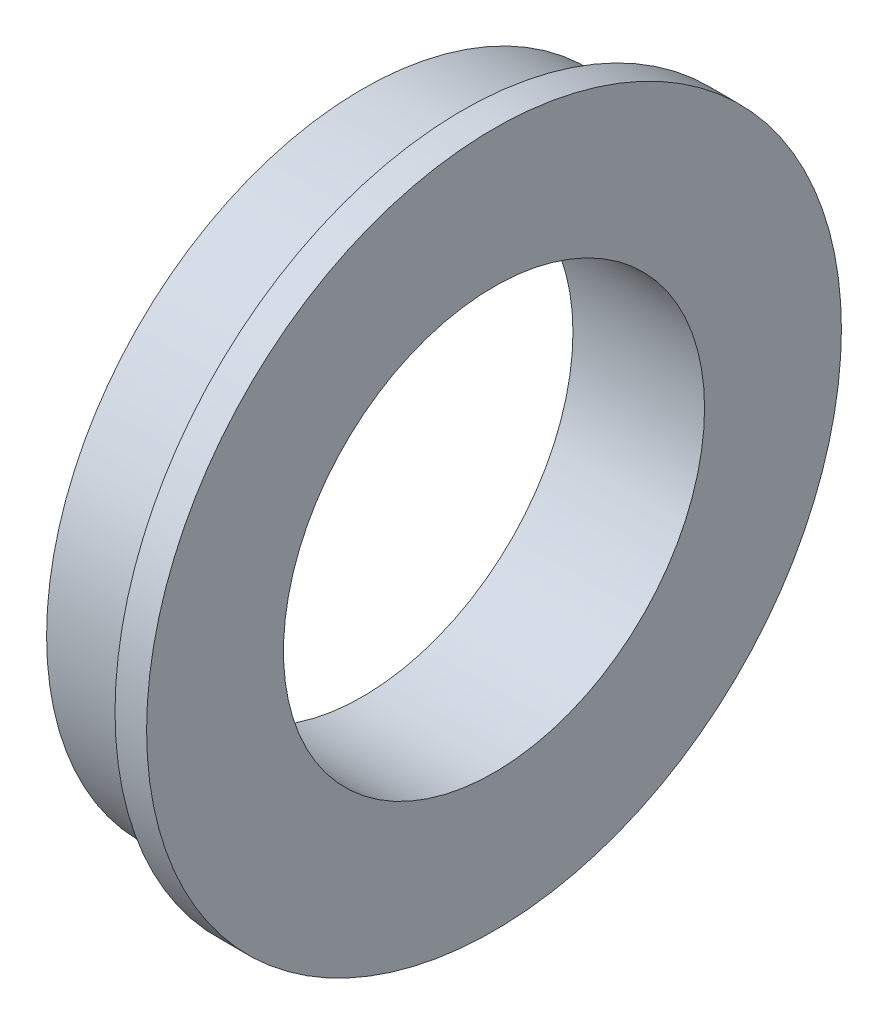
ISO-10303-21;
HEADER;
FILE_DESCRIPTION(('STEP AP214'),'2;1');
FILE_NAME('part.step','',(''),(''),'','','');
FILE_SCHEMA(('AUTOMOTIVE_DESIGN { 1 0 10303 214 1 1 1 1 }'));
ENDSEC;
DATA;
#1=APPLICATION_CONTEXT('core data for automotive mechanical design processes');
#2=APPLICATION_PROTOCOL_DEFINITION('international standard','automotive_design',2000,#1);
#3=PRODUCT_CONTEXT('',#1,'mechanical');
#4=PRODUCT('Part','Part','',(#3));
#5=PRODUCT_RELATED_PRODUCT_CATEGORY('part','',(#4));
#6=PRODUCT_DEFINITION_FORMATION('','',#4);
#7=PRODUCT_DEFINITION_CONTEXT('part definition',#1,'design');
#8=PRODUCT_DEFINITION('design','',#6,#7);
#9=PRODUCT_DEFINITION_SHAPE('','',#8);
#10=(LENGTH_UNIT() NAMED_UNIT(*) SI_UNIT(.MILLI.,.METRE.));
#11=(NAMED_UNIT(*) PLANE_ANGLE_UNIT() SI_UNIT($,.RADIAN.));
#12=(NAMED_UNIT(*) SI_UNIT($,.STERADIAN.) SOLID_ANGLE_UNIT());
#13=UNCERTAINTY_MEASURE_WITH_UNIT(LENGTH_MEASURE(1.E-05),#10,'distance_accuracy_value','');
#14=(GEOMETRIC_REPRESENTATION_CONTEXT(3) GLOBAL_UNCERTAINTY_ASSIGNED_CONTEXT((#13)) GLOBAL_UNIT_ASSIGNED_CONTEXT((#10,
#11,#12)) REPRESENTATION_CONTEXT('',''));
#15=CARTESIAN_POINT('',(0.,0.,0.));
#16=DIRECTION('',(0.,0.,1.));
#17=DIRECTION('',(1.,0.,0.));
#18=AXIS2_PLACEMENT_3D('',#15,#16,#17);
#19=CARTESIAN_POINT('',(0.,0.,0.));
#20=DIRECTION('',(1.,0.,0.));
#21=DIRECTION('',(0.,0.,-1.));
#22=AXIS2_PLACEMENT_3D('',#19,#20,#21);
#23=PLANE('',#22);
#24=CARTESIAN_POINT('',(0.,0.,0.));
#25=DIRECTION('',(1.,0.,0.));
#26=DIRECTION('',(0.,0.,-1.));
#27=AXIS2_PLACEMENT_3D('',#24,#25,#26);
#28=CIRCLE('',#27,4.);
#29=CARTESIAN_POINT('',(0.,0.,-4.));
#30=VERTEX_POINT('',#29);
#31=EDGE_CURVE('E49',#30,#30,#28,.T.);
#32=ORIENTED_EDGE('',*,*,#31,.T.);
#33=EDGE_LOOP('',(#32));
#34=FACE_BOUND('',#33,.T.);
#35=CARTESIAN_POINT('',(0.,0.,0.));
#36=DIRECTION('',(-1.,0.,0.));
#37=DIRECTION('',(0.,0.,1.));
#38=AXIS2_PLACEMENT_3D('',#35,#36,#37);
#39=CIRCLE('',#38,6.);
#40=CARTESIAN_POINT('',(0.,0.,6.));
#41=VERTEX_POINT('',#40);
#42=EDGE_CURVE('E54',#41,#41,#39,.T.);
#43=ORIENTED_EDGE('',*,*,#42,.T.);
#44=EDGE_LOOP('',(#43));
#45=FACE_BOUND('',#44,.T.);
#46=ADVANCED_FACE('F37',(#34,#45),#23,.F.);
#47=CARTESIAN_POINT('',(2.5,0.,0.));
#48=DIRECTION('',(-1.,0.,0.));
#49=DIRECTION('',(0.,0.,1.));
#50=AXIS2_PLACEMENT_3D('',#47,#48,#49);
#51=CYLINDRICAL_SURFACE('',#50,6.6);
#52=CARTESIAN_POINT('',(2.5,0.,0.));
#53=DIRECTION('',(1.,0.,0.));
#54=DIRECTION('',(0.,0.,-1.));
#55=AXIS2_PLACEMENT_3D('',#52,#53,#54);
#56=CIRCLE('',#55,6.6);
#57=CARTESIAN_POINT('',(2.5,0.,-6.6));
#58=VERTEX_POINT('',#57);
#59=EDGE_CURVE('E10',#58,#58,#56,.T.);
#60=ORIENTED_EDGE('',*,*,#59,.F.);
#61=EDGE_LOOP('',(#60));
#62=FACE_BOUND('',#61,.T.);
#63=CARTESIAN_POINT('',(1.9,0.,0.));
#64=DIRECTION('',(-1.,0.,0.));
#65=DIRECTION('',(0.,0.,1.));
#66=AXIS2_PLACEMENT_3D('',#63,#64,#65);
#67=CIRCLE('',#66,6.6);
#68=CARTESIAN_POINT('',(1.9,0.,6.6));
#69=VERTEX_POINT('',#68);
#70=EDGE_CURVE('E41',#69,#69,#67,.T.);
#71=ORIENTED_EDGE('',*,*,#70,.F.);
#72=EDGE_LOOP('',(#71));
#73=FACE_BOUND('',#72,.T.);
#74=ADVANCED_FACE('F39',(#62,#73),#51,.T.);
#75=CARTESIAN_POINT('',(2.5,0.,0.));
#76=DIRECTION('',(1.,0.,0.));
#77=DIRECTION('',(0.,0.,-1.));
#78=AXIS2_PLACEMENT_3D('',#75,#76,#77);
#79=PLANE('',#78);
#80=ORIENTED_EDGE('',*,*,#59,.T.);
#81=EDGE_LOOP('',(#80));
#82=FACE_BOUND('',#81,.T.);
#83=CARTESIAN_POINT('',(2.5,0.,0.));
#84=DIRECTION('',(1.,0.,0.));
#85=DIRECTION('',(0.,0.,-1.));
#86=AXIS2_PLACEMENT_3D('',#83,#84,#85);
#87=CIRCLE('',#86,4.);
#88=CARTESIAN_POINT('',(2.5,0.,-4.));
#89=VERTEX_POINT('',#88);
#90=EDGE_CURVE('E45',#89,#89,#87,.T.);
#91=ORIENTED_EDGE('',*,*,#90,.F.);
#92=EDGE_LOOP('',(#91));
#93=FACE_BOUND('',#92,.T.);
#94=ADVANCED_FACE('F67',(#82,#93),#79,.T.);
#95=CARTESIAN_POINT('',(2.5,0.,0.));
#96=DIRECTION('',(-1.,0.,0.));
#97=DIRECTION('',(0.,0.,1.));
#98=AXIS2_PLACEMENT_3D('',#95,#96,#97);
#99=CYLINDRICAL_SURFACE('',#98,4.);
#100=ORIENTED_EDGE('',*,*,#90,.T.);
#101=EDGE_LOOP('',(#100));
#102=FACE_BOUND('',#101,.T.);
#103=ORIENTED_EDGE('',*,*,#31,.F.);
#104=EDGE_LOOP('',(#103));
#105=FACE_BOUND('',#104,.T.);
#106=ADVANCED_FACE('F73',(#102,#105),#99,.F.);
#107=CARTESIAN_POINT('',(1.9,0.,0.));
#108=DIRECTION('',(-1.,0.,0.));
#109=DIRECTION('',(0.,0.,1.));
#110=AXIS2_PLACEMENT_3D('',#107,#108,#109);
#111=PLANE('',#110);
#112=CARTESIAN_POINT('',(1.9,0.,0.));
#113=DIRECTION('',(-1.,0.,0.));
#114=DIRECTION('',(0.,0.,1.));
#115=AXIS2_PLACEMENT_3D('',#112,#113,#114);
#116=CIRCLE('',#115,6.);
#117=CARTESIAN_POINT('',(1.9,0.,6.));
#118=VERTEX_POINT('',#117);
#119=EDGE_CURVE('E57',#118,#118,#116,.T.);
#120=ORIENTED_EDGE('',*,*,#119,.F.);
#121=EDGE_LOOP('',(#120));
#122=FACE_BOUND('',#121,.T.);
#123=ORIENTED_EDGE('',*,*,#70,.T.);
#124=EDGE_LOOP('',(#123));
#125=FACE_BOUND('',#124,.T.);
#126=ADVANCED_FACE('F64',(#122,#125),#111,.T.);
#127=CARTESIAN_POINT('',(1.9,0.,0.));
#128=DIRECTION('',(-1.,0.,0.));
#129=DIRECTION('',(0.,0.,1.));
#130=AXIS2_PLACEMENT_3D('',#127,#128,#129);
#131=CYLINDRICAL_SURFACE('',#130,6.);
#132=CARTESIAN_POINT('',(1.9,0.,6.));
#133=CARTESIAN_POINT('',(1.88020833333333,0.,6.));
#134=CARTESIAN_POINT('',(1.86041666666667,0.,6.));
#135=CARTESIAN_POINT('',(1.82083333333333,0.,6.));
#136=CARTESIAN_POINT('',(1.80104166666667,0.,6.));
#137=CARTESIAN_POINT('',(1.76145833333333,0.,6.));
#138=CARTESIAN_POINT('',(1.74166666666667,0.,6.));
#139=CARTESIAN_POINT('',(1.70208333333333,0.,6.));
#140=CARTESIAN_POINT('',(1.68229166666667,0.,6.));
#141=CARTESIAN_POINT('',(1.64270833333333,0.,6.));
#142=CARTESIAN_POINT('',(1.62291666666667,0.,6.));
#143=CARTESIAN_POINT('',(1.58333333333333,0.,6.));
#144=CARTESIAN_POINT('',(1.56354166666667,0.,6.));
#145=CARTESIAN_POINT('',(1.52395833333333,0.,6.));
#146=CARTESIAN_POINT('',(1.50416666666667,0.,6.));
#147=CARTESIAN_POINT('',(1.46458333333333,0.,6.));
#148=CARTESIAN_POINT('',(1.44479166666667,0.,6.));
#149=CARTESIAN_POINT('',(1.40520833333333,0.,6.));
#150=CARTESIAN_POINT('',(1.38541666666667,0.,6.));
#151=CARTESIAN_POINT('',(1.34583333333333,0.,6.));
#152=CARTESIAN_POINT('',(1.32604166666667,0.,6.));
#153=CARTESIAN_POINT('',(1.28645833333333,0.,6.));
#154=CARTESIAN_POINT('',(1.26666666666667,0.,6.));
#155=CARTESIAN_POINT('',(1.22708333333333,0.,6.));
#156=CARTESIAN_POINT('',(1.20729166666667,0.,6.));
#157=CARTESIAN_POINT('',(1.16770833333333,0.,6.));
#158=CARTESIAN_POINT('',(1.14791666666667,0.,6.));
#159=CARTESIAN_POINT('',(1.10833333333333,0.,6.));
#160=CARTESIAN_POINT('',(1.08854166666667,0.,6.));
#161=CARTESIAN_POINT('',(1.04895833333333,0.,6.));
#162=CARTESIAN_POINT('',(1.02916666666667,0.,6.));
#163=CARTESIAN_POINT('',(0.989583333333333,0.,6.));
#164=CARTESIAN_POINT('',(0.969791666666667,0.,6.));
#165=CARTESIAN_POINT('',(0.930208333333333,0.,6.));
#166=CARTESIAN_POINT('',(0.910416666666667,0.,6.));
#167=CARTESIAN_POINT('',(0.870833333333333,0.,6.));
#168=CARTESIAN_POINT('',(0.851041666666667,0.,6.));
#169=CARTESIAN_POINT('',(0.811458333333334,0.,6.));
#170=CARTESIAN_POINT('',(0.791666666666667,0.,6.));
#171=CARTESIAN_POINT('',(0.752083333333334,0.,6.));
#172=CARTESIAN_POINT('',(0.732291666666667,0.,6.));
#173=CARTESIAN_POINT('',(0.692708333333333,0.,6.));
#174=CARTESIAN_POINT('',(0.672916666666667,0.,6.));
#175=CARTESIAN_POINT('',(0.633333333333333,0.,6.));
#176=CARTESIAN_POINT('',(0.613541666666667,0.,6.));
#177=CARTESIAN_POINT('',(0.573958333333333,0.,6.));
#178=CARTESIAN_POINT('',(0.554166666666667,0.,6.));
#179=CARTESIAN_POINT('',(0.514583333333334,0.,6.));
#180=CARTESIAN_POINT('',(0.494791666666667,0.,6.));
#181=CARTESIAN_POINT('',(0.455208333333333,0.,6.));
#182=CARTESIAN_POINT('',(0.435416666666667,0.,6.));
#183=CARTESIAN_POINT('',(0.395833333333333,0.,6.));
#184=CARTESIAN_POINT('',(0.376041666666667,0.,6.));
#185=CARTESIAN_POINT('',(0.336458333333333,0.,6.));
#186=CARTESIAN_POINT('',(0.316666666666667,0.,6.));
#187=CARTESIAN_POINT('',(0.277083333333333,0.,6.));
#188=CARTESIAN_POINT('',(0.257291666666667,0.,6.));
#189=CARTESIAN_POINT('',(0.217708333333333,0.,6.));
#190=CARTESIAN_POINT('',(0.197916666666667,0.,6.));
#191=CARTESIAN_POINT('',(0.158333333333333,0.,6.));
#192=CARTESIAN_POINT('',(0.138541666666667,0.,6.));
#193=CARTESIAN_POINT('',(0.0989583333333333,0.,6.));
#194=CARTESIAN_POINT('',(0.0791666666666666,0.,6.));
#195=CARTESIAN_POINT('',(0.0395833333333333,0.,6.));
#196=CARTESIAN_POINT('',(0.0197916666666666,0.,6.));
#197=CARTESIAN_POINT('',(0.,0.,6.));
#198=B_SPLINE_CURVE_WITH_KNOTS('',3,(#132,#133,#134,#135,#136,#137,#138,#139,#140,#141,#142,
#143,#144,#145,#146,#147,#148,#149,#150,#151,#152,#153,#154,#155,#156,#157,#158,#159,#160,#161,
#162,#163,#164,#165,#166,#167,#168,#169,#170,#171,#172,#173,#174,#175,#176,#177,#178,#179,#180,
#181,#182,#183,#184,#185,#186,#187,#188,#189,#190,#191,#192,#193,#194,#195,#196,#197),
.UNSPECIFIED.,.F.,.F.,(4,2,2,2,2,2,2,2,2,2,2,2,2,2,2,2,2,2,2,2,2,2,2,2,2,2,2,2,2,2,2,2,4),(0.,
0.0593750000000002,0.11875,0.178125,0.2375,0.296875,0.35625,0.415625,0.475,0.534375,0.59375,
0.653125,0.7125,0.771875,0.83125,0.890625,0.95,1.009375,1.06875,1.128125,1.1875,1.246875,
1.30625,1.365625,1.425,1.484375,1.54375,1.603125,1.6625,1.721875,1.78125,1.840625,1.9),.UNSPECIFIED.);
#199=EDGE_CURVE('BSEAM85',#118,#41,#198,.T.);
#200=ORIENTED_EDGE('',*,*,#119,.T.);
#201=ORIENTED_EDGE('',*,*,#42,.F.);
#202=ORIENTED_EDGE('',*,*,#199,.T.);
#203=ORIENTED_EDGE('',*,*,#199,.F.);
#204=EDGE_LOOP('',(#200,#202,#201,#203));
#205=FACE_BOUND('',#204,.T.);
#206=ADVANCED_FACE('F85',(#205),#131,.T.);
#207=CLOSED_SHELL('',(#46,#74,#94,#106,#126,#206));
#208=MANIFOLD_SOLID_BREP('B2',#207);
#209=ADVANCED_BREP_SHAPE_REPRESENTATION('',(#18,#208),#14);
#210=SHAPE_DEFINITION_REPRESENTATION(#9,#209);
ENDSEC;
END-ISO-10303-21;
